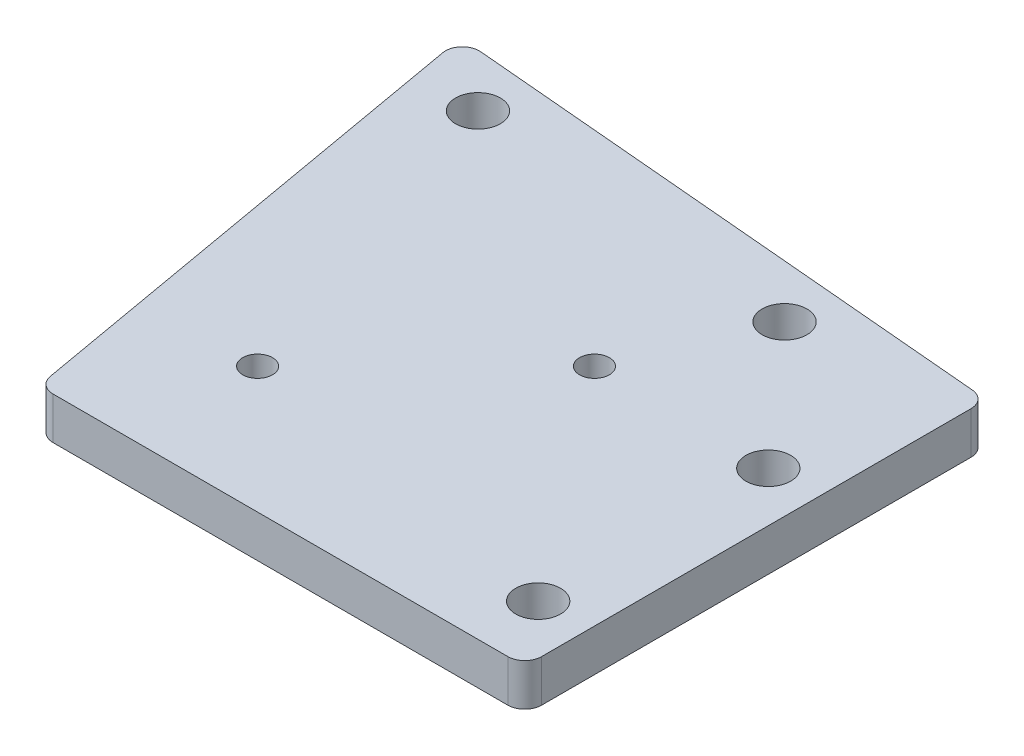
ISO-10303-21;
HEADER;
FILE_DESCRIPTION(('STEP AP214'),'2;1');
FILE_NAME('part.step','',(''),(''),'','','');
FILE_SCHEMA(('AUTOMOTIVE_DESIGN { 1 0 10303 214 1 1 1 1 }'));
ENDSEC;
DATA;
#1=APPLICATION_CONTEXT('core data for automotive mechanical design processes');
#2=APPLICATION_PROTOCOL_DEFINITION('international standard','automotive_design',2000,#1);
#3=PRODUCT_CONTEXT('',#1,'mechanical');
#4=PRODUCT('Part','Part','',(#3));
#5=PRODUCT_RELATED_PRODUCT_CATEGORY('part','',(#4));
#6=PRODUCT_DEFINITION_FORMATION('','',#4);
#7=PRODUCT_DEFINITION_CONTEXT('part definition',#1,'design');
#8=PRODUCT_DEFINITION('design','',#6,#7);
#9=PRODUCT_DEFINITION_SHAPE('','',#8);
#10=(LENGTH_UNIT() NAMED_UNIT(*) SI_UNIT(.MILLI.,.METRE.));
#11=(NAMED_UNIT(*) PLANE_ANGLE_UNIT() SI_UNIT($,.RADIAN.));
#12=(NAMED_UNIT(*) SI_UNIT($,.STERADIAN.) SOLID_ANGLE_UNIT());
#13=UNCERTAINTY_MEASURE_WITH_UNIT(LENGTH_MEASURE(1.E-05),#10,'distance_accuracy_value','');
#14=(GEOMETRIC_REPRESENTATION_CONTEXT(3) GLOBAL_UNCERTAINTY_ASSIGNED_CONTEXT((#13)) GLOBAL_UNIT_ASSIGNED_CONTEXT((#10,
#11,#12)) REPRESENTATION_CONTEXT('',''));
#15=CARTESIAN_POINT('',(0.,0.,0.));
#16=DIRECTION('',(0.,0.,1.));
#17=DIRECTION('',(1.,0.,0.));
#18=AXIS2_PLACEMENT_3D('',#15,#16,#17);
#19=CARTESIAN_POINT('',(46.6347959999999,-6.35,31.75));
#20=DIRECTION('',(1.,0.,0.));
#21=DIRECTION('',(0.,0.,-1.));
#22=AXIS2_PLACEMENT_3D('',#19,#20,#21);
#23=PLANE('',#22);
#24=DIRECTION('',(0.,0.,-1.));
#25=VECTOR('',#24,1.);
#26=CARTESIAN_POINT('',(46.6347960000003,-6.35,-22.8249392386804));
#27=LINE('',#26,#25);
#28=CARTESIAN_POINT('',(46.6347960000018,-6.35,29.21));
#29=VERTEX_POINT('',#28);
#30=CARTESIAN_POINT('',(46.6347959999999,-6.35,-35.5547556198264));
#31=VERTEX_POINT('',#30);
#32=EDGE_CURVE('E166',#29,#31,#27,.T.);
#33=ORIENTED_EDGE('',*,*,#32,.T.);
#34=DIRECTION('',(0.,1.,0.));
#35=VECTOR('',#34,1.);
#36=CARTESIAN_POINT('',(46.6347960000004,-6.35,-35.5547556198264));
#37=LINE('',#36,#35);
#38=CARTESIAN_POINT('',(46.6347960000004,0.,-35.5547556198264));
#39=VERTEX_POINT('',#38);
#40=EDGE_CURVE('E158',#31,#39,#37,.T.);
#41=ORIENTED_EDGE('',*,*,#40,.T.);
#42=DIRECTION('',(0.,0.,-1.));
#43=VECTOR('',#42,1.);
#44=CARTESIAN_POINT('',(46.6347959999999,0.,31.75));
#45=LINE('',#44,#43);
#46=CARTESIAN_POINT('',(46.6347959999999,0.,29.21));
#47=VERTEX_POINT('',#46);
#48=EDGE_CURVE('E111',#47,#39,#45,.T.);
#49=ORIENTED_EDGE('',*,*,#48,.F.);
#50=DIRECTION('',(0.,1.,0.));
#51=VECTOR('',#50,1.);
#52=CARTESIAN_POINT('',(46.6347959999999,-6.35,29.21));
#53=LINE('',#52,#51);
#54=EDGE_CURVE('E156',#47,#29,#53,.F.);
#55=ORIENTED_EDGE('',*,*,#54,.T.);
#56=EDGE_LOOP('',(#33,#41,#49,#55));
#57=FACE_BOUND('',#56,.T.);
#58=ADVANCED_FACE('F41',(#57),#23,.T.);
#59=CARTESIAN_POINT('',(46.6347959999999,-6.35,31.75));
#60=DIRECTION('',(0.,0.,1.));
#61=DIRECTION('',(1.,0.,0.));
#62=AXIS2_PLACEMENT_3D('',#59,#60,#61);
#63=PLANE('',#62);
#64=DIRECTION('',(1.,0.,0.));
#65=VECTOR('',#64,1.);
#66=CARTESIAN_POINT('',(46.6347959999999,0.,31.75));
#67=LINE('',#66,#65);
#68=CARTESIAN_POINT('',(-24.5101002266884,0.,31.75));
#69=VERTEX_POINT('',#68);
#70=CARTESIAN_POINT('',(44.0947959999999,0.,31.75));
#71=VERTEX_POINT('',#70);
#72=EDGE_CURVE('E163',#69,#71,#67,.T.);
#73=ORIENTED_EDGE('',*,*,#72,.F.);
#74=DIRECTION('',(0.,1.,0.));
#75=VECTOR('',#74,1.);
#76=CARTESIAN_POINT('',(-24.5101002266884,-6.35,31.75));
#77=LINE('',#76,#75);
#78=CARTESIAN_POINT('',(-24.5101002266884,-6.35,31.75));
#79=VERTEX_POINT('',#78);
#80=EDGE_CURVE('E11',#69,#79,#77,.F.);
#81=ORIENTED_EDGE('',*,*,#80,.T.);
#82=DIRECTION('',(1.,0.,0.));
#83=VECTOR('',#82,1.);
#84=CARTESIAN_POINT('',(46.6347959999999,-6.35,31.75));
#85=LINE('',#84,#83);
#86=CARTESIAN_POINT('',(44.0947959999999,-6.35,31.75));
#87=VERTEX_POINT('',#86);
#88=EDGE_CURVE('E133',#79,#87,#85,.T.);
#89=ORIENTED_EDGE('',*,*,#88,.T.);
#90=DIRECTION('',(0.,1.,0.));
#91=VECTOR('',#90,1.);
#92=CARTESIAN_POINT('',(44.0947959999999,-6.35,31.75));
#93=LINE('',#92,#91);
#94=EDGE_CURVE('E49',#87,#71,#93,.T.);
#95=ORIENTED_EDGE('',*,*,#94,.T.);
#96=EDGE_LOOP('',(#73,#81,#89,#95));
#97=FACE_BOUND('',#96,.T.);
#98=ADVANCED_FACE('F162',(#97),#63,.T.);
#99=CARTESIAN_POINT('',(-26.6414132898787,-6.35,31.75));
#100=DIRECTION('',(-0.984807753012209,0.,0.173648177666927));
#101=DIRECTION('',(0.173648177666927,0.,0.984807753012209));
#102=AXIS2_PLACEMENT_3D('',#99,#100,#101);
#103=PLANE('',#102);
#104=DIRECTION('',(0.173648177666927,0.,0.984807753012209));
#105=VECTOR('',#104,1.);
#106=CARTESIAN_POINT('',(-26.6414132898787,0.,31.75));
#107=LINE('',#106,#105);
#108=CARTESIAN_POINT('',(-39.685137951641,0.,-42.224638534353));
#109=VERTEX_POINT('',#108);
#110=CARTESIAN_POINT('',(-27.0115119193394,0.,29.651066371274));
#111=VERTEX_POINT('',#110);
#112=EDGE_CURVE('E127',#109,#111,#107,.T.);
#113=ORIENTED_EDGE('',*,*,#112,.F.);
#114=DIRECTION('',(0.,1.,0.));
#115=VECTOR('',#114,1.);
#116=CARTESIAN_POINT('',(-39.685137951641,-6.35,-42.224638534353));
#117=LINE('',#116,#115);
#118=CARTESIAN_POINT('',(-39.685137951641,-6.35,-42.224638534353));
#119=VERTEX_POINT('',#118);
#120=EDGE_CURVE('E148',#109,#119,#117,.F.);
#121=ORIENTED_EDGE('',*,*,#120,.T.);
#122=DIRECTION('',(0.173648177666927,0.,0.984807753012209));
#123=VECTOR('',#122,1.);
#124=CARTESIAN_POINT('',(-26.6414132898787,-6.35,31.75));
#125=LINE('',#124,#123);
#126=CARTESIAN_POINT('',(-27.0115119193394,-6.35,29.651066371274));
#127=VERTEX_POINT('',#126);
#128=EDGE_CURVE('E137',#119,#127,#125,.T.);
#129=ORIENTED_EDGE('',*,*,#128,.T.);
#130=DIRECTION('',(0.,1.,0.));
#131=VECTOR('',#130,1.);
#132=CARTESIAN_POINT('',(-27.0115119193394,-6.35,29.651066371274));
#133=LINE('',#132,#131);
#134=EDGE_CURVE('E145',#127,#111,#133,.T.);
#135=ORIENTED_EDGE('',*,*,#134,.T.);
#136=EDGE_LOOP('',(#113,#121,#129,#135));
#137=FACE_BOUND('',#136,.T.);
#138=ADVANCED_FACE('F246',(#137),#103,.T.);
#139=CARTESIAN_POINT('',(46.6347959999999,-6.35,-37.8822368018307));
#140=DIRECTION('',(0.0871557427476511,0.,-0.996194698091746));
#141=DIRECTION('',(-0.996194698091746,0.,-0.0871557427476511));
#142=AXIS2_PLACEMENT_3D('',#139,#140,#141);
#143=PLANE('',#142);
#144=DIRECTION('',(-0.996194698091746,0.,-0.0871557427476511));
#145=VECTOR('',#144,1.);
#146=CARTESIAN_POINT('',(46.6347959999999,-6.35,-37.8822368018307));
#147=LINE('',#146,#145);
#148=CARTESIAN_POINT('',(44.3161715865795,-6.35,-38.0850901529794));
#149=VERTEX_POINT('',#148);
#150=CARTESIAN_POINT('',(-36.962350672411,-6.35,-45.19603943878));
#151=VERTEX_POINT('',#150);
#152=EDGE_CURVE('E171',#149,#151,#147,.T.);
#153=ORIENTED_EDGE('',*,*,#152,.T.);
#154=DIRECTION('',(0.,1.,0.));
#155=VECTOR('',#154,1.);
#156=CARTESIAN_POINT('',(-36.9623506724109,-6.35,-45.19603943878));
#157=LINE('',#156,#155);
#158=CARTESIAN_POINT('',(-36.962350672411,0.,-45.19603943878));
#159=VERTEX_POINT('',#158);
#160=EDGE_CURVE('E126',#151,#159,#157,.T.);
#161=ORIENTED_EDGE('',*,*,#160,.T.);
#162=DIRECTION('',(-0.996194698091746,0.,-0.0871557427476511));
#163=VECTOR('',#162,1.);
#164=CARTESIAN_POINT('',(46.6347959999999,0.,-37.8822368018307));
#165=LINE('',#164,#163);
#166=CARTESIAN_POINT('',(44.3161715865795,0.,-38.0850901529794));
#167=VERTEX_POINT('',#166);
#168=EDGE_CURVE('E109',#167,#159,#165,.T.);
#169=ORIENTED_EDGE('',*,*,#168,.F.);
#170=DIRECTION('',(0.,1.,0.));
#171=VECTOR('',#170,1.);
#172=CARTESIAN_POINT('',(44.3161715865795,-6.35,-38.0850901529794));
#173=LINE('',#172,#171);
#174=EDGE_CURVE('E123',#167,#149,#173,.F.);
#175=ORIENTED_EDGE('',*,*,#174,.T.);
#176=EDGE_LOOP('',(#153,#161,#169,#175));
#177=FACE_BOUND('',#176,.T.);
#178=ADVANCED_FACE('F122',(#177),#143,.T.);
#179=CARTESIAN_POINT('',(0.,-6.35,0.));
#180=DIRECTION('',(0.,1.,0.));
#181=DIRECTION('',(0.,0.,1.));
#182=AXIS2_PLACEMENT_3D('',#179,#180,#181);
#183=PLANE('',#182);
#184=CARTESIAN_POINT('',(12.6980821551917,-6.34999999999999,-12.6980821551917));
#185=DIRECTION('',(0.,1.,0.));
#186=DIRECTION('',(0.,0.,1.));
#187=AXIS2_PLACEMENT_3D('',#184,#185,#186);
#188=CIRCLE('',#187,2.24789999999999);
#189=CARTESIAN_POINT('',(12.6980821551917,-6.34999999999999,-10.4501821551917));
#190=VERTEX_POINT('',#189);
#191=EDGE_CURVE('E204',#190,#190,#188,.T.);
#192=ORIENTED_EDGE('',*,*,#191,.T.);
#193=EDGE_LOOP('',(#192));
#194=FACE_BOUND('',#193,.T.);
#195=CARTESIAN_POINT('',(-12.6980821551919,-6.34999999999999,12.6980821551918));
#196=DIRECTION('',(0.,1.,0.));
#197=DIRECTION('',(0.,0.,1.));
#198=AXIS2_PLACEMENT_3D('',#195,#196,#197);
#199=CIRCLE('',#198,2.24789999999999);
#200=CARTESIAN_POINT('',(-12.6980821551919,-6.34999999999999,14.9459821551918));
#201=VERTEX_POINT('',#200);
#202=EDGE_CURVE('E198',#201,#201,#199,.T.);
#203=ORIENTED_EDGE('',*,*,#202,.T.);
#204=EDGE_LOOP('',(#203));
#205=FACE_BOUND('',#204,.T.);
#206=CARTESIAN_POINT('',(39.1347855999999,-6.35,22.225));
#207=DIRECTION('',(0.,-1.,0.));
#208=DIRECTION('',(0.,0.,-1.));
#209=AXIS2_PLACEMENT_3D('',#206,#207,#208);
#210=CIRCLE('',#209,3.3782);
#211=CARTESIAN_POINT('',(39.1347855999999,-6.35,18.8468));
#212=VERTEX_POINT('',#211);
#213=EDGE_CURVE('E195',#212,#212,#210,.T.);
#214=ORIENTED_EDGE('',*,*,#213,.F.);
#215=EDGE_LOOP('',(#214));
#216=FACE_BOUND('',#215,.T.);
#217=CARTESIAN_POINT('',(39.1347855999999,-6.35,-12.4822368018307));
#218=DIRECTION('',(0.,-1.,0.));
#219=DIRECTION('',(0.,0.,-1.));
#220=AXIS2_PLACEMENT_3D('',#217,#218,#219);
#221=CIRCLE('',#220,3.3782);
#222=CARTESIAN_POINT('',(39.1347855999999,-6.35,-15.8604368018307));
#223=VERTEX_POINT('',#222);
#224=EDGE_CURVE('E189',#223,#223,#221,.T.);
#225=ORIENTED_EDGE('',*,*,#224,.F.);
#226=EDGE_LOOP('',(#225));
#227=FACE_BOUND('',#226,.T.);
#228=CARTESIAN_POINT('',(-29.4325836993493,-6.35,-37.2651438104608));
#229=DIRECTION('',(0.,-1.,0.));
#230=DIRECTION('',(0.,0.,-1.));
#231=AXIS2_PLACEMENT_3D('',#228,#229,#230);
#232=CIRCLE('',#231,3.3782);
#233=CARTESIAN_POINT('',(-29.4325836993493,-6.35,-40.6433438104608));
#234=VERTEX_POINT('',#233);
#235=EDGE_CURVE('E183',#234,#234,#232,.T.);
#236=ORIENTED_EDGE('',*,*,#235,.F.);
#237=EDGE_LOOP('',(#236));
#238=FACE_BOUND('',#237,.T.);
#239=CARTESIAN_POINT('',(21.2347959999999,-6.35,-32.8323224762046));
#240=DIRECTION('',(0.,-1.,0.));
#241=DIRECTION('',(0.,0.,-1.));
#242=AXIS2_PLACEMENT_3D('',#239,#240,#241);
#243=CIRCLE('',#242,3.3782);
#244=CARTESIAN_POINT('',(21.2347959999999,-6.35,-36.2105224762046));
#245=VERTEX_POINT('',#244);
#246=EDGE_CURVE('E177',#245,#245,#243,.T.);
#247=ORIENTED_EDGE('',*,*,#246,.F.);
#248=EDGE_LOOP('',(#247));
#249=FACE_BOUND('',#248,.T.);
#250=ORIENTED_EDGE('',*,*,#128,.F.);
#251=CARTESIAN_POINT('',(-37.18372625899,-6.35,-42.665704905627));
#252=DIRECTION('',(0.,1.,0.));
#253=DIRECTION('',(0.,0.,1.));
#254=AXIS2_PLACEMENT_3D('',#251,#252,#253);
#255=CIRCLE('',#254,2.54);
#256=EDGE_CURVE('E154',#119,#151,#255,.F.);
#257=ORIENTED_EDGE('',*,*,#256,.T.);
#258=ORIENTED_EDGE('',*,*,#152,.F.);
#259=CARTESIAN_POINT('',(44.0947960000004,-6.35,-35.5547556198264));
#260=DIRECTION('',(0.,1.,0.));
#261=DIRECTION('',(0.,0.,1.));
#262=AXIS2_PLACEMENT_3D('',#259,#260,#261);
#263=CIRCLE('',#262,2.54);
#264=EDGE_CURVE('E132',#149,#31,#263,.F.);
#265=ORIENTED_EDGE('',*,*,#264,.T.);
#266=ORIENTED_EDGE('',*,*,#32,.F.);
#267=CARTESIAN_POINT('',(44.0947959999999,-6.35,29.21));
#268=DIRECTION('',(0.,1.,0.));
#269=DIRECTION('',(0.,0.,1.));
#270=AXIS2_PLACEMENT_3D('',#267,#268,#269);
#271=CIRCLE('',#270,2.54);
#272=EDGE_CURVE('E56',#29,#87,#271,.F.);
#273=ORIENTED_EDGE('',*,*,#272,.T.);
#274=ORIENTED_EDGE('',*,*,#88,.F.);
#275=CARTESIAN_POINT('',(-24.5101002266884,-6.35,29.21));
#276=DIRECTION('',(0.,1.,0.));
#277=DIRECTION('',(0.,0.,1.));
#278=AXIS2_PLACEMENT_3D('',#275,#276,#277);
#279=CIRCLE('',#278,2.54);
#280=EDGE_CURVE('E151',#79,#127,#279,.F.);
#281=ORIENTED_EDGE('',*,*,#280,.T.);
#282=EDGE_LOOP('',(#250,#257,#258,#265,#266,#273,#274,#281));
#283=FACE_BOUND('',#282,.T.);
#284=ADVANCED_FACE('F216',(#194,#205,#216,#227,#238,#249,#283),#183,.F.);
#285=CARTESIAN_POINT('',(0.,0.,0.));
#286=DIRECTION('',(0.,1.,0.));
#287=DIRECTION('',(0.,0.,1.));
#288=AXIS2_PLACEMENT_3D('',#285,#286,#287);
#289=PLANE('',#288);
#290=CARTESIAN_POINT('',(12.6980821551917,0.,-12.6980821551917));
#291=DIRECTION('',(0.,1.,0.));
#292=DIRECTION('',(0.,0.,1.));
#293=AXIS2_PLACEMENT_3D('',#290,#291,#292);
#294=CIRCLE('',#293,2.24789999999999);
#295=CARTESIAN_POINT('',(12.6980821551917,0.,-10.4501821551917));
#296=VERTEX_POINT('',#295);
#297=EDGE_CURVE('E207',#296,#296,#294,.T.);
#298=ORIENTED_EDGE('',*,*,#297,.F.);
#299=EDGE_LOOP('',(#298));
#300=FACE_BOUND('',#299,.T.);
#301=CARTESIAN_POINT('',(-12.6980821551919,0.,12.6980821551918));
#302=DIRECTION('',(0.,1.,0.));
#303=DIRECTION('',(0.,0.,1.));
#304=AXIS2_PLACEMENT_3D('',#301,#302,#303);
#305=CIRCLE('',#304,2.24789999999999);
#306=CARTESIAN_POINT('',(-12.6980821551919,0.,14.9459821551918));
#307=VERTEX_POINT('',#306);
#308=EDGE_CURVE('E201',#307,#307,#305,.T.);
#309=ORIENTED_EDGE('',*,*,#308,.F.);
#310=EDGE_LOOP('',(#309));
#311=FACE_BOUND('',#310,.T.);
#312=CARTESIAN_POINT('',(39.1347855999999,0.,22.225));
#313=DIRECTION('',(0.,-1.,0.));
#314=DIRECTION('',(0.,0.,-1.));
#315=AXIS2_PLACEMENT_3D('',#312,#313,#314);
#316=CIRCLE('',#315,3.3782);
#317=CARTESIAN_POINT('',(39.1347855999999,0.,18.8468));
#318=VERTEX_POINT('',#317);
#319=EDGE_CURVE('E192',#318,#318,#316,.T.);
#320=ORIENTED_EDGE('',*,*,#319,.T.);
#321=EDGE_LOOP('',(#320));
#322=FACE_BOUND('',#321,.T.);
#323=CARTESIAN_POINT('',(39.1347855999999,0.,-12.4822368018307));
#324=DIRECTION('',(0.,-1.,0.));
#325=DIRECTION('',(0.,0.,-1.));
#326=AXIS2_PLACEMENT_3D('',#323,#324,#325);
#327=CIRCLE('',#326,3.3782);
#328=CARTESIAN_POINT('',(39.1347855999999,0.,-15.8604368018307));
#329=VERTEX_POINT('',#328);
#330=EDGE_CURVE('E186',#329,#329,#327,.T.);
#331=ORIENTED_EDGE('',*,*,#330,.T.);
#332=EDGE_LOOP('',(#331));
#333=FACE_BOUND('',#332,.T.);
#334=CARTESIAN_POINT('',(-29.4325836993493,0.,-37.2651438104608));
#335=DIRECTION('',(0.,-1.,0.));
#336=DIRECTION('',(0.,0.,-1.));
#337=AXIS2_PLACEMENT_3D('',#334,#335,#336);
#338=CIRCLE('',#337,3.3782);
#339=CARTESIAN_POINT('',(-29.4325836993493,0.,-40.6433438104608));
#340=VERTEX_POINT('',#339);
#341=EDGE_CURVE('E180',#340,#340,#338,.T.);
#342=ORIENTED_EDGE('',*,*,#341,.T.);
#343=EDGE_LOOP('',(#342));
#344=FACE_BOUND('',#343,.T.);
#345=CARTESIAN_POINT('',(21.2347959999999,0.,-32.8323224762046));
#346=DIRECTION('',(0.,-1.,0.));
#347=DIRECTION('',(0.,0.,-1.));
#348=AXIS2_PLACEMENT_3D('',#345,#346,#347);
#349=CIRCLE('',#348,3.3782);
#350=CARTESIAN_POINT('',(21.2347959999999,0.,-36.2105224762046));
#351=VERTEX_POINT('',#350);
#352=EDGE_CURVE('E128',#351,#351,#349,.T.);
#353=ORIENTED_EDGE('',*,*,#352,.T.);
#354=EDGE_LOOP('',(#353));
#355=FACE_BOUND('',#354,.T.);
#356=ORIENTED_EDGE('',*,*,#168,.T.);
#357=CARTESIAN_POINT('',(-37.18372625899,0.,-42.665704905627));
#358=DIRECTION('',(0.,1.,0.));
#359=DIRECTION('',(0.,0.,1.));
#360=AXIS2_PLACEMENT_3D('',#357,#358,#359);
#361=CIRCLE('',#360,2.54);
#362=EDGE_CURVE('E116',#159,#109,#361,.T.);
#363=ORIENTED_EDGE('',*,*,#362,.T.);
#364=ORIENTED_EDGE('',*,*,#112,.T.);
#365=CARTESIAN_POINT('',(-24.5101002266884,0.,29.21));
#366=DIRECTION('',(0.,1.,0.));
#367=DIRECTION('',(0.,0.,1.));
#368=AXIS2_PLACEMENT_3D('',#365,#366,#367);
#369=CIRCLE('',#368,2.54);
#370=EDGE_CURVE('E117',#111,#69,#369,.T.);
#371=ORIENTED_EDGE('',*,*,#370,.T.);
#372=ORIENTED_EDGE('',*,*,#72,.T.);
#373=CARTESIAN_POINT('',(44.0947959999999,0.,29.21));
#374=DIRECTION('',(0.,1.,0.));
#375=DIRECTION('',(0.,0.,1.));
#376=AXIS2_PLACEMENT_3D('',#373,#374,#375);
#377=CIRCLE('',#376,2.54);
#378=EDGE_CURVE('E135',#71,#47,#377,.T.);
#379=ORIENTED_EDGE('',*,*,#378,.T.);
#380=ORIENTED_EDGE('',*,*,#48,.T.);
#381=CARTESIAN_POINT('',(44.0947960000004,0.,-35.5547556198264));
#382=DIRECTION('',(0.,1.,0.));
#383=DIRECTION('',(0.,0.,1.));
#384=AXIS2_PLACEMENT_3D('',#381,#382,#383);
#385=CIRCLE('',#384,2.54);
#386=EDGE_CURVE('E106',#39,#167,#385,.T.);
#387=ORIENTED_EDGE('',*,*,#386,.T.);
#388=EDGE_LOOP('',(#356,#363,#364,#371,#372,#379,#380,#387));
#389=FACE_BOUND('',#388,.T.);
#390=ADVANCED_FACE('F108',(#300,#311,#322,#333,#344,#355,#389),#289,.T.);
#391=CARTESIAN_POINT('',(21.2347959999999,-6.35,-32.8323224762046));
#392=DIRECTION('',(0.,-1.,0.));
#393=DIRECTION('',(0.,0.,-1.));
#394=AXIS2_PLACEMENT_3D('',#391,#392,#393);
#395=CYLINDRICAL_SURFACE('',#394,3.3782);
#396=ORIENTED_EDGE('',*,*,#352,.F.);
#397=EDGE_LOOP('',(#396));
#398=FACE_BOUND('',#397,.T.);
#399=ORIENTED_EDGE('',*,*,#246,.T.);
#400=EDGE_LOOP('',(#399));
#401=FACE_BOUND('',#400,.T.);
#402=ADVANCED_FACE('F215',(#398,#401),#395,.F.);
#403=CARTESIAN_POINT('',(-29.4325836993493,-6.35,-37.2651438104608));
#404=DIRECTION('',(0.,-1.,0.));
#405=DIRECTION('',(0.,0.,-1.));
#406=AXIS2_PLACEMENT_3D('',#403,#404,#405);
#407=CYLINDRICAL_SURFACE('',#406,3.3782);
#408=ORIENTED_EDGE('',*,*,#341,.F.);
#409=EDGE_LOOP('',(#408));
#410=FACE_BOUND('',#409,.T.);
#411=ORIENTED_EDGE('',*,*,#235,.T.);
#412=EDGE_LOOP('',(#411));
#413=FACE_BOUND('',#412,.T.);
#414=ADVANCED_FACE('F230',(#410,#413),#407,.F.);
#415=CARTESIAN_POINT('',(39.1347855999999,-6.35,-12.4822368018307));
#416=DIRECTION('',(0.,-1.,0.));
#417=DIRECTION('',(0.,0.,-1.));
#418=AXIS2_PLACEMENT_3D('',#415,#416,#417);
#419=CYLINDRICAL_SURFACE('',#418,3.3782);
#420=ORIENTED_EDGE('',*,*,#330,.F.);
#421=EDGE_LOOP('',(#420));
#422=FACE_BOUND('',#421,.T.);
#423=ORIENTED_EDGE('',*,*,#224,.T.);
#424=EDGE_LOOP('',(#423));
#425=FACE_BOUND('',#424,.T.);
#426=ADVANCED_FACE('F284',(#422,#425),#419,.F.);
#427=CARTESIAN_POINT('',(39.1347855999999,-6.35,22.225));
#428=DIRECTION('',(0.,-1.,0.));
#429=DIRECTION('',(0.,0.,-1.));
#430=AXIS2_PLACEMENT_3D('',#427,#428,#429);
#431=CYLINDRICAL_SURFACE('',#430,3.3782);
#432=ORIENTED_EDGE('',*,*,#319,.F.);
#433=EDGE_LOOP('',(#432));
#434=FACE_BOUND('',#433,.T.);
#435=ORIENTED_EDGE('',*,*,#213,.T.);
#436=EDGE_LOOP('',(#435));
#437=FACE_BOUND('',#436,.T.);
#438=ADVANCED_FACE('F277',(#434,#437),#431,.F.);
#439=CARTESIAN_POINT('',(-12.6980821551919,0.,12.6980821551918));
#440=DIRECTION('',(0.,1.,0.));
#441=DIRECTION('',(0.,0.,1.));
#442=AXIS2_PLACEMENT_3D('',#439,#440,#441);
#443=CYLINDRICAL_SURFACE('',#442,2.24789999999999);
#444=ORIENTED_EDGE('',*,*,#202,.F.);
#445=EDGE_LOOP('',(#444));
#446=FACE_BOUND('',#445,.T.);
#447=ORIENTED_EDGE('',*,*,#308,.T.);
#448=EDGE_LOOP('',(#447));
#449=FACE_BOUND('',#448,.T.);
#450=ADVANCED_FACE('F271',(#446,#449),#443,.F.);
#451=CARTESIAN_POINT('',(12.6980821551917,0.,-12.6980821551917));
#452=DIRECTION('',(0.,1.,0.));
#453=DIRECTION('',(0.,0.,1.));
#454=AXIS2_PLACEMENT_3D('',#451,#452,#453);
#455=CYLINDRICAL_SURFACE('',#454,2.24789999999999);
#456=ORIENTED_EDGE('',*,*,#191,.F.);
#457=EDGE_LOOP('',(#456));
#458=FACE_BOUND('',#457,.T.);
#459=ORIENTED_EDGE('',*,*,#297,.T.);
#460=EDGE_LOOP('',(#459));
#461=FACE_BOUND('',#460,.T.);
#462=ADVANCED_FACE('F211',(#458,#461),#455,.F.);
#463=CARTESIAN_POINT('',(-37.18372625899,-6.35,-42.665704905627));
#464=DIRECTION('',(0.,1.,0.));
#465=DIRECTION('',(0.,0.,1.));
#466=AXIS2_PLACEMENT_3D('',#463,#464,#465);
#467=CYLINDRICAL_SURFACE('',#466,2.54);
#468=ORIENTED_EDGE('',*,*,#256,.F.);
#469=ORIENTED_EDGE('',*,*,#120,.F.);
#470=ORIENTED_EDGE('',*,*,#362,.F.);
#471=ORIENTED_EDGE('',*,*,#160,.F.);
#472=EDGE_LOOP('',(#468,#469,#470,#471));
#473=FACE_BOUND('',#472,.T.);
#474=ADVANCED_FACE('F244',(#473),#467,.T.);
#475=CARTESIAN_POINT('',(44.0947960000004,-6.35,-35.5547556198264));
#476=DIRECTION('',(0.,1.,0.));
#477=DIRECTION('',(0.,0.,1.));
#478=AXIS2_PLACEMENT_3D('',#475,#476,#477);
#479=CYLINDRICAL_SURFACE('',#478,2.54);
#480=ORIENTED_EDGE('',*,*,#264,.F.);
#481=ORIENTED_EDGE('',*,*,#174,.F.);
#482=ORIENTED_EDGE('',*,*,#386,.F.);
#483=ORIENTED_EDGE('',*,*,#40,.F.);
#484=EDGE_LOOP('',(#480,#481,#482,#483));
#485=FACE_BOUND('',#484,.T.);
#486=ADVANCED_FACE('F131',(#485),#479,.T.);
#487=CARTESIAN_POINT('',(-24.5101002266884,-6.35,29.21));
#488=DIRECTION('',(0.,1.,0.));
#489=DIRECTION('',(0.,0.,1.));
#490=AXIS2_PLACEMENT_3D('',#487,#488,#489);
#491=CYLINDRICAL_SURFACE('',#490,2.54);
#492=ORIENTED_EDGE('',*,*,#280,.F.);
#493=ORIENTED_EDGE('',*,*,#80,.F.);
#494=ORIENTED_EDGE('',*,*,#370,.F.);
#495=ORIENTED_EDGE('',*,*,#134,.F.);
#496=EDGE_LOOP('',(#492,#493,#494,#495));
#497=FACE_BOUND('',#496,.T.);
#498=ADVANCED_FACE('F248',(#497),#491,.T.);
#499=CARTESIAN_POINT('',(44.0947959999999,-6.35,29.21));
#500=DIRECTION('',(0.,1.,0.));
#501=DIRECTION('',(0.,0.,1.));
#502=AXIS2_PLACEMENT_3D('',#499,#500,#501);
#503=CYLINDRICAL_SURFACE('',#502,2.54);
#504=ORIENTED_EDGE('',*,*,#272,.F.);
#505=ORIENTED_EDGE('',*,*,#54,.F.);
#506=ORIENTED_EDGE('',*,*,#378,.F.);
#507=ORIENTED_EDGE('',*,*,#94,.F.);
#508=EDGE_LOOP('',(#504,#505,#506,#507));
#509=FACE_BOUND('',#508,.T.);
#510=ADVANCED_FACE('F43',(#509),#503,.T.);
#511=CLOSED_SHELL('',(#58,#98,#138,#178,#284,#390,#402,#414,#426,#438,#450,#462,#474,#486,#498,#510));
#512=MANIFOLD_SOLID_BREP('B2',#511);
#513=ADVANCED_BREP_SHAPE_REPRESENTATION('',(#18,#512),#14);
#514=SHAPE_DEFINITION_REPRESENTATION(#9,#513);
ENDSEC;
END-ISO-10303-21;
